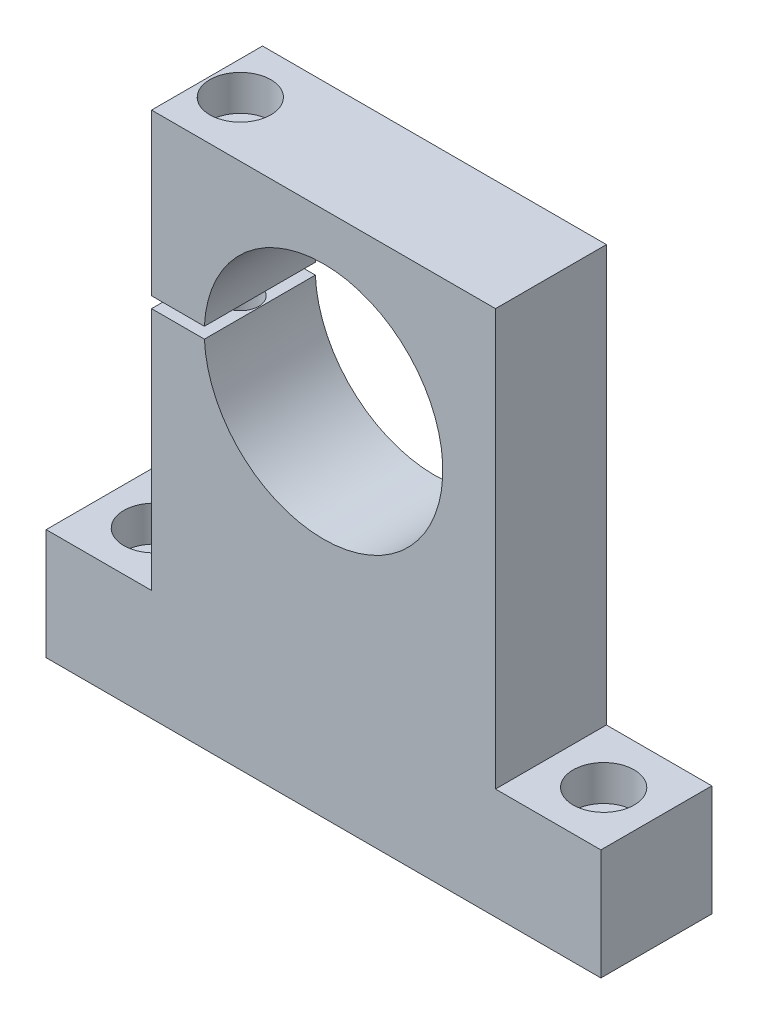
ISO-10303-21;
HEADER;
FILE_DESCRIPTION(('STEP AP214'),'2;1');
FILE_NAME('part.step','',(''),(''),'','','');
FILE_SCHEMA(('AUTOMOTIVE_DESIGN { 1 0 10303 214 1 1 1 1 }'));
ENDSEC;
DATA;
#1=APPLICATION_CONTEXT('core data for automotive mechanical design processes');
#2=APPLICATION_PROTOCOL_DEFINITION('international standard','automotive_design',2000,#1);
#3=PRODUCT_CONTEXT('',#1,'mechanical');
#4=PRODUCT('Part','Part','',(#3));
#5=PRODUCT_RELATED_PRODUCT_CATEGORY('part','',(#4));
#6=PRODUCT_DEFINITION_FORMATION('','',#4);
#7=PRODUCT_DEFINITION_CONTEXT('part definition',#1,'design');
#8=PRODUCT_DEFINITION('design','',#6,#7);
#9=PRODUCT_DEFINITION_SHAPE('','',#8);
#10=(LENGTH_UNIT() NAMED_UNIT(*) SI_UNIT(.MILLI.,.METRE.));
#11=(NAMED_UNIT(*) PLANE_ANGLE_UNIT() SI_UNIT($,.RADIAN.));
#12=(NAMED_UNIT(*) SI_UNIT($,.STERADIAN.) SOLID_ANGLE_UNIT());
#13=UNCERTAINTY_MEASURE_WITH_UNIT(LENGTH_MEASURE(1.E-05),#10,'distance_accuracy_value','');
#14=(GEOMETRIC_REPRESENTATION_CONTEXT(3) GLOBAL_UNCERTAINTY_ASSIGNED_CONTEXT((#13)) GLOBAL_UNIT_ASSIGNED_CONTEXT((#10,
#11,#12)) REPRESENTATION_CONTEXT('',''));
#15=CARTESIAN_POINT('',(0.,0.,0.));
#16=DIRECTION('',(0.,0.,1.));
#17=DIRECTION('',(1.,0.,0.));
#18=AXIS2_PLACEMENT_3D('',#15,#16,#17);
#19=CARTESIAN_POINT('',(19.,20.,20.));
#20=DIRECTION('',(1.,0.,0.));
#21=DIRECTION('',(0.,0.,-1.));
#22=AXIS2_PLACEMENT_3D('',#19,#20,#21);
#23=PLANE('',#22);
#24=DIRECTION('',(0.,-1.,0.));
#25=VECTOR('',#24,1.);
#26=CARTESIAN_POINT('',(19.,20.,0.));
#27=LINE('',#26,#25);
#28=CARTESIAN_POINT('',(19.,95.,0.));
#29=VERTEX_POINT('',#28);
#30=CARTESIAN_POINT('',(19.,66.,0.));
#31=VERTEX_POINT('',#30);
#32=EDGE_CURVE('E187',#29,#31,#27,.T.);
#33=ORIENTED_EDGE('',*,*,#32,.T.);
#34=DIRECTION('',(0.,0.,1.));
#35=VECTOR('',#34,1.);
#36=CARTESIAN_POINT('',(19.,66.,20.));
#37=LINE('',#36,#35);
#38=CARTESIAN_POINT('',(19.,66.,20.));
#39=VERTEX_POINT('',#38);
#40=EDGE_CURVE('E221',#31,#39,#37,.T.);
#41=ORIENTED_EDGE('',*,*,#40,.T.);
#42=DIRECTION('',(0.,-1.,0.));
#43=VECTOR('',#42,1.);
#44=CARTESIAN_POINT('',(19.,20.,20.));
#45=LINE('',#44,#43);
#46=CARTESIAN_POINT('',(19.,95.,20.));
#47=VERTEX_POINT('',#46);
#48=EDGE_CURVE('E169',#47,#39,#45,.T.);
#49=ORIENTED_EDGE('',*,*,#48,.F.);
#50=DIRECTION('',(0.,0.,-1.));
#51=VECTOR('',#50,1.);
#52=CARTESIAN_POINT('',(19.,95.,20.));
#53=LINE('',#52,#51);
#54=EDGE_CURVE('E196',#47,#29,#53,.T.);
#55=ORIENTED_EDGE('',*,*,#54,.T.);
#56=EDGE_LOOP('',(#33,#41,#49,#55));
#57=FACE_BOUND('',#56,.T.);
#58=ADVANCED_FACE('F35',(#57),#23,.F.);
#59=CARTESIAN_POINT('',(25.,95.,10.));
#60=DIRECTION('',(0.,1.,0.));
#61=DIRECTION('',(0.,0.,1.));
#62=AXIS2_PLACEMENT_3D('',#59,#60,#61);
#63=CYLINDRICAL_SURFACE('',#62,3.29999999999999);
#64=CARTESIAN_POINT('',(25.,66.,10.));
#65=DIRECTION('',(0.,1.,0.));
#66=DIRECTION('',(0.,0.,1.));
#67=AXIS2_PLACEMENT_3D('',#64,#65,#66);
#68=CIRCLE('',#67,3.29999999999999);
#69=CARTESIAN_POINT('',(25.,66.,13.3));
#70=VERTEX_POINT('',#69);
#71=EDGE_CURVE('E39',#70,#70,#68,.F.);
#72=ORIENTED_EDGE('',*,*,#71,.T.);
#73=EDGE_LOOP('',(#72));
#74=FACE_BOUND('',#73,.T.);
#75=CARTESIAN_POINT('',(25.,88.6,10.));
#76=DIRECTION('',(0.,1.,0.));
#77=DIRECTION('',(0.,0.,1.));
#78=AXIS2_PLACEMENT_3D('',#75,#76,#77);
#79=CIRCLE('',#78,3.30000000000001);
#80=CARTESIAN_POINT('',(25.,88.6,13.3));
#81=VERTEX_POINT('',#80);
#82=EDGE_CURVE('E230',#81,#81,#79,.T.);
#83=ORIENTED_EDGE('',*,*,#82,.T.);
#84=EDGE_LOOP('',(#83));
#85=FACE_BOUND('',#84,.T.);
#86=ADVANCED_FACE('F324',(#74,#85),#63,.F.);
#87=CARTESIAN_POINT('',(0.,0.,20.));
#88=DIRECTION('',(0.,0.,-1.));
#89=DIRECTION('',(-1.,0.,0.));
#90=AXIS2_PLACEMENT_3D('',#87,#88,#89);
#91=PLANE('',#90);
#92=ORIENTED_EDGE('',*,*,#48,.T.);
#93=DIRECTION('',(1.,0.,0.));
#94=VECTOR('',#93,1.);
#95=CARTESIAN_POINT('',(15.9047146945495,66.,20.));
#96=LINE('',#95,#94);
#97=CARTESIAN_POINT('',(28.5232684050855,66.,20.));
#98=VERTEX_POINT('',#97);
#99=EDGE_CURVE('E210',#39,#98,#96,.T.);
#100=ORIENTED_EDGE('',*,*,#99,.T.);
#101=CARTESIAN_POINT('',(50.,65.,20.));
#102=DIRECTION('',(0.,0.,1.));
#103=DIRECTION('',(1.,0.,0.));
#104=AXIS2_PLACEMENT_3D('',#101,#102,#103);
#105=CIRCLE('',#104,21.5);
#106=CARTESIAN_POINT('',(28.5232684050855,64.,20.));
#107=VERTEX_POINT('',#106);
#108=EDGE_CURVE('E145',#107,#98,#105,.T.);
#109=ORIENTED_EDGE('',*,*,#108,.F.);
#110=DIRECTION('',(-1.,0.,0.));
#111=VECTOR('',#110,1.);
#112=CARTESIAN_POINT('',(15.9047146945495,64.,20.));
#113=LINE('',#112,#111);
#114=CARTESIAN_POINT('',(19.,64.,20.));
#115=VERTEX_POINT('',#114);
#116=EDGE_CURVE('E60',#107,#115,#113,.T.);
#117=ORIENTED_EDGE('',*,*,#116,.T.);
#118=CARTESIAN_POINT('',(19.,20.,20.));
#119=VERTEX_POINT('',#118);
#120=EDGE_CURVE('E168',#115,#119,#45,.T.);
#121=ORIENTED_EDGE('',*,*,#120,.T.);
#122=DIRECTION('',(-1.,0.,0.));
#123=VECTOR('',#122,1.);
#124=CARTESIAN_POINT('',(0.,20.,20.));
#125=LINE('',#124,#123);
#126=CARTESIAN_POINT('',(0.,20.,20.));
#127=VERTEX_POINT('',#126);
#128=EDGE_CURVE('E172',#119,#127,#125,.T.);
#129=ORIENTED_EDGE('',*,*,#128,.T.);
#130=DIRECTION('',(0.,-1.,0.));
#131=VECTOR('',#130,1.);
#132=CARTESIAN_POINT('',(0.,0.,20.));
#133=LINE('',#132,#131);
#134=CARTESIAN_POINT('',(0.,0.,20.));
#135=VERTEX_POINT('',#134);
#136=EDGE_CURVE('E154',#127,#135,#133,.T.);
#137=ORIENTED_EDGE('',*,*,#136,.T.);
#138=DIRECTION('',(1.,0.,0.));
#139=VECTOR('',#138,1.);
#140=CARTESIAN_POINT('',(0.,0.,20.));
#141=LINE('',#140,#139);
#142=CARTESIAN_POINT('',(100.,0.,20.));
#143=VERTEX_POINT('',#142);
#144=EDGE_CURVE('E157',#135,#143,#141,.T.);
#145=ORIENTED_EDGE('',*,*,#144,.T.);
#146=DIRECTION('',(0.,1.,0.));
#147=VECTOR('',#146,1.);
#148=CARTESIAN_POINT('',(100.,0.,20.));
#149=LINE('',#148,#147);
#150=CARTESIAN_POINT('',(100.,20.,20.));
#151=VERTEX_POINT('',#150);
#152=EDGE_CURVE('E160',#143,#151,#149,.T.);
#153=ORIENTED_EDGE('',*,*,#152,.T.);
#154=DIRECTION('',(-1.,0.,0.));
#155=VECTOR('',#154,1.);
#156=CARTESIAN_POINT('',(100.,20.,20.));
#157=LINE('',#156,#155);
#158=CARTESIAN_POINT('',(81.,20.,20.));
#159=VERTEX_POINT('',#158);
#160=EDGE_CURVE('E162',#151,#159,#157,.T.);
#161=ORIENTED_EDGE('',*,*,#160,.T.);
#162=DIRECTION('',(0.,1.,0.));
#163=VECTOR('',#162,1.);
#164=CARTESIAN_POINT('',(81.,20.,20.));
#165=LINE('',#164,#163);
#166=CARTESIAN_POINT('',(81.,95.,20.));
#167=VERTEX_POINT('',#166);
#168=EDGE_CURVE('E164',#159,#167,#165,.T.);
#169=ORIENTED_EDGE('',*,*,#168,.T.);
#170=DIRECTION('',(-1.,0.,0.));
#171=VECTOR('',#170,1.);
#172=CARTESIAN_POINT('',(19.,95.,20.));
#173=LINE('',#172,#171);
#174=EDGE_CURVE('E166',#167,#47,#173,.T.);
#175=ORIENTED_EDGE('',*,*,#174,.T.);
#176=EDGE_LOOP('',(#92,#100,#109,#117,#121,#129,#137,#145,#153,#161,#169,#175));
#177=FACE_BOUND('',#176,.T.);
#178=ADVANCED_FACE('F295',(#177),#91,.F.);
#179=CARTESIAN_POINT('',(0.,0.,0.));
#180=DIRECTION('',(0.,0.,-1.));
#181=DIRECTION('',(-1.,0.,0.));
#182=AXIS2_PLACEMENT_3D('',#179,#180,#181);
#183=PLANE('',#182);
#184=DIRECTION('',(1.,0.,0.));
#185=VECTOR('',#184,1.);
#186=CARTESIAN_POINT('',(15.9047146945495,66.,0.));
#187=LINE('',#186,#185);
#188=CARTESIAN_POINT('',(28.5232684050855,66.,0.));
#189=VERTEX_POINT('',#188);
#190=EDGE_CURVE('E52',#31,#189,#187,.T.);
#191=ORIENTED_EDGE('',*,*,#190,.F.);
#192=ORIENTED_EDGE('',*,*,#32,.F.);
#193=DIRECTION('',(-1.,0.,0.));
#194=VECTOR('',#193,1.);
#195=CARTESIAN_POINT('',(19.,95.,0.));
#196=LINE('',#195,#194);
#197=CARTESIAN_POINT('',(81.,95.,0.));
#198=VERTEX_POINT('',#197);
#199=EDGE_CURVE('E185',#198,#29,#196,.T.);
#200=ORIENTED_EDGE('',*,*,#199,.F.);
#201=DIRECTION('',(0.,1.,0.));
#202=VECTOR('',#201,1.);
#203=CARTESIAN_POINT('',(81.,20.,0.));
#204=LINE('',#203,#202);
#205=CARTESIAN_POINT('',(81.,20.,0.));
#206=VERTEX_POINT('',#205);
#207=EDGE_CURVE('E183',#206,#198,#204,.T.);
#208=ORIENTED_EDGE('',*,*,#207,.F.);
#209=DIRECTION('',(-1.,0.,0.));
#210=VECTOR('',#209,1.);
#211=CARTESIAN_POINT('',(100.,20.,0.));
#212=LINE('',#211,#210);
#213=CARTESIAN_POINT('',(100.,20.,0.));
#214=VERTEX_POINT('',#213);
#215=EDGE_CURVE('E181',#214,#206,#212,.T.);
#216=ORIENTED_EDGE('',*,*,#215,.F.);
#217=DIRECTION('',(0.,1.,0.));
#218=VECTOR('',#217,1.);
#219=CARTESIAN_POINT('',(100.,0.,0.));
#220=LINE('',#219,#218);
#221=CARTESIAN_POINT('',(100.,0.,0.));
#222=VERTEX_POINT('',#221);
#223=EDGE_CURVE('E179',#222,#214,#220,.T.);
#224=ORIENTED_EDGE('',*,*,#223,.F.);
#225=DIRECTION('',(1.,0.,0.));
#226=VECTOR('',#225,1.);
#227=CARTESIAN_POINT('',(0.,0.,0.));
#228=LINE('',#227,#226);
#229=CARTESIAN_POINT('',(0.,0.,0.));
#230=VERTEX_POINT('',#229);
#231=EDGE_CURVE('E177',#230,#222,#228,.T.);
#232=ORIENTED_EDGE('',*,*,#231,.F.);
#233=DIRECTION('',(0.,-1.,0.));
#234=VECTOR('',#233,1.);
#235=CARTESIAN_POINT('',(0.,0.,0.));
#236=LINE('',#235,#234);
#237=CARTESIAN_POINT('',(0.,20.,0.));
#238=VERTEX_POINT('',#237);
#239=EDGE_CURVE('E148',#238,#230,#236,.T.);
#240=ORIENTED_EDGE('',*,*,#239,.F.);
#241=DIRECTION('',(-1.,0.,0.));
#242=VECTOR('',#241,1.);
#243=CARTESIAN_POINT('',(0.,20.,0.));
#244=LINE('',#243,#242);
#245=CARTESIAN_POINT('',(19.,20.,0.));
#246=VERTEX_POINT('',#245);
#247=EDGE_CURVE('E158',#246,#238,#244,.T.);
#248=ORIENTED_EDGE('',*,*,#247,.F.);
#249=CARTESIAN_POINT('',(19.,64.,0.));
#250=VERTEX_POINT('',#249);
#251=EDGE_CURVE('E141',#250,#246,#27,.T.);
#252=ORIENTED_EDGE('',*,*,#251,.F.);
#253=DIRECTION('',(-1.,0.,0.));
#254=VECTOR('',#253,1.);
#255=CARTESIAN_POINT('',(15.9047146945495,64.,0.));
#256=LINE('',#255,#254);
#257=CARTESIAN_POINT('',(28.5232684050855,64.,0.));
#258=VERTEX_POINT('',#257);
#259=EDGE_CURVE('E126',#258,#250,#256,.T.);
#260=ORIENTED_EDGE('',*,*,#259,.F.);
#261=CARTESIAN_POINT('',(50.,65.,0.));
#262=DIRECTION('',(0.,0.,1.));
#263=DIRECTION('',(1.,0.,0.));
#264=AXIS2_PLACEMENT_3D('',#261,#262,#263);
#265=CIRCLE('',#264,21.5);
#266=EDGE_CURVE('E139',#258,#189,#265,.T.);
#267=ORIENTED_EDGE('',*,*,#266,.T.);
#268=EDGE_LOOP('',(#191,#192,#200,#208,#216,#224,#232,#240,#248,#252,#260,#267));
#269=FACE_BOUND('',#268,.T.);
#270=ADVANCED_FACE('F138',(#269),#183,.T.);
#271=CARTESIAN_POINT('',(0.,0.,20.));
#272=DIRECTION('',(1.,0.,0.));
#273=DIRECTION('',(0.,0.,-1.));
#274=AXIS2_PLACEMENT_3D('',#271,#272,#273);
#275=PLANE('',#274);
#276=ORIENTED_EDGE('',*,*,#239,.T.);
#277=DIRECTION('',(0.,0.,-1.));
#278=VECTOR('',#277,1.);
#279=CARTESIAN_POINT('',(0.,0.,20.));
#280=LINE('',#279,#278);
#281=EDGE_CURVE('E11',#135,#230,#280,.T.);
#282=ORIENTED_EDGE('',*,*,#281,.F.);
#283=ORIENTED_EDGE('',*,*,#136,.F.);
#284=DIRECTION('',(0.,0.,-1.));
#285=VECTOR('',#284,1.);
#286=CARTESIAN_POINT('',(0.,20.,20.));
#287=LINE('',#286,#285);
#288=EDGE_CURVE('E174',#127,#238,#287,.T.);
#289=ORIENTED_EDGE('',*,*,#288,.T.);
#290=EDGE_LOOP('',(#276,#282,#283,#289));
#291=FACE_BOUND('',#290,.T.);
#292=ADVANCED_FACE('F37',(#291),#275,.F.);
#293=CARTESIAN_POINT('',(0.,0.,20.));
#294=DIRECTION('',(0.,1.,0.));
#295=DIRECTION('',(0.,0.,1.));
#296=AXIS2_PLACEMENT_3D('',#293,#294,#295);
#297=PLANE('',#296);
#298=CARTESIAN_POINT('',(25.,0.,10.));
#299=DIRECTION('',(0.,1.,0.));
#300=DIRECTION('',(0.,0.,1.));
#301=AXIS2_PLACEMENT_3D('',#298,#299,#300);
#302=CIRCLE('',#301,3.29999999999998);
#303=CARTESIAN_POINT('',(25.,0.,13.3));
#304=VERTEX_POINT('',#303);
#305=EDGE_CURVE('E233',#304,#304,#302,.T.);
#306=ORIENTED_EDGE('',*,*,#305,.T.);
#307=EDGE_LOOP('',(#306));
#308=FACE_BOUND('',#307,.T.);
#309=CARTESIAN_POINT('',(9.5,0.,10.));
#310=DIRECTION('',(0.,1.,0.));
#311=DIRECTION('',(0.,0.,1.));
#312=AXIS2_PLACEMENT_3D('',#309,#310,#311);
#313=CIRCLE('',#312,3.3);
#314=CARTESIAN_POINT('',(9.5,0.,13.3));
#315=VERTEX_POINT('',#314);
#316=EDGE_CURVE('E245',#315,#315,#313,.T.);
#317=ORIENTED_EDGE('',*,*,#316,.T.);
#318=EDGE_LOOP('',(#317));
#319=FACE_BOUND('',#318,.T.);
#320=CARTESIAN_POINT('',(90.5,0.,9.99999999999999));
#321=DIRECTION('',(0.,1.,0.));
#322=DIRECTION('',(0.,0.,1.));
#323=AXIS2_PLACEMENT_3D('',#320,#321,#322);
#324=CIRCLE('',#323,3.3);
#325=CARTESIAN_POINT('',(90.5,0.,13.3));
#326=VERTEX_POINT('',#325);
#327=EDGE_CURVE('E146',#326,#326,#324,.T.);
#328=ORIENTED_EDGE('',*,*,#327,.T.);
#329=EDGE_LOOP('',(#328));
#330=FACE_BOUND('',#329,.T.);
#331=ORIENTED_EDGE('',*,*,#231,.T.);
#332=DIRECTION('',(0.,0.,-1.));
#333=VECTOR('',#332,1.);
#334=CARTESIAN_POINT('',(100.,0.,20.));
#335=LINE('',#334,#333);
#336=EDGE_CURVE('E44',#143,#222,#335,.T.);
#337=ORIENTED_EDGE('',*,*,#336,.F.);
#338=ORIENTED_EDGE('',*,*,#144,.F.);
#339=ORIENTED_EDGE('',*,*,#281,.T.);
#340=EDGE_LOOP('',(#331,#337,#338,#339));
#341=FACE_BOUND('',#340,.T.);
#342=ADVANCED_FACE('F302',(#308,#319,#330,#341),#297,.F.);
#343=CARTESIAN_POINT('',(100.,0.,20.));
#344=DIRECTION('',(-1.,0.,0.));
#345=DIRECTION('',(0.,0.,1.));
#346=AXIS2_PLACEMENT_3D('',#343,#344,#345);
#347=PLANE('',#346);
#348=ORIENTED_EDGE('',*,*,#223,.T.);
#349=DIRECTION('',(0.,0.,-1.));
#350=VECTOR('',#349,1.);
#351=CARTESIAN_POINT('',(100.,20.,20.));
#352=LINE('',#351,#350);
#353=EDGE_CURVE('E205',#151,#214,#352,.T.);
#354=ORIENTED_EDGE('',*,*,#353,.F.);
#355=ORIENTED_EDGE('',*,*,#152,.F.);
#356=ORIENTED_EDGE('',*,*,#336,.T.);
#357=EDGE_LOOP('',(#348,#354,#355,#356));
#358=FACE_BOUND('',#357,.T.);
#359=ADVANCED_FACE('F276',(#358),#347,.F.);
#360=CARTESIAN_POINT('',(100.,20.,20.));
#361=DIRECTION('',(0.,-1.,0.));
#362=DIRECTION('',(0.,0.,-1.));
#363=AXIS2_PLACEMENT_3D('',#360,#361,#362);
#364=PLANE('',#363);
#365=CARTESIAN_POINT('',(90.5,20.,9.99999999999999));
#366=DIRECTION('',(0.,1.,0.));
#367=DIRECTION('',(0.,0.,1.));
#368=AXIS2_PLACEMENT_3D('',#365,#366,#367);
#369=CIRCLE('',#368,5.49999999999999);
#370=CARTESIAN_POINT('',(90.5,20.,15.5));
#371=VERTEX_POINT('',#370);
#372=EDGE_CURVE('E248',#371,#371,#369,.T.);
#373=ORIENTED_EDGE('',*,*,#372,.F.);
#374=EDGE_LOOP('',(#373));
#375=FACE_BOUND('',#374,.T.);
#376=ORIENTED_EDGE('',*,*,#215,.T.);
#377=DIRECTION('',(0.,0.,-1.));
#378=VECTOR('',#377,1.);
#379=CARTESIAN_POINT('',(81.,20.,20.));
#380=LINE('',#379,#378);
#381=EDGE_CURVE('E202',#159,#206,#380,.T.);
#382=ORIENTED_EDGE('',*,*,#381,.F.);
#383=ORIENTED_EDGE('',*,*,#160,.F.);
#384=ORIENTED_EDGE('',*,*,#353,.T.);
#385=EDGE_LOOP('',(#376,#382,#383,#384));
#386=FACE_BOUND('',#385,.T.);
#387=ADVANCED_FACE('F272',(#375,#386),#364,.F.);
#388=CARTESIAN_POINT('',(81.,20.,20.));
#389=DIRECTION('',(-1.,0.,0.));
#390=DIRECTION('',(0.,0.,1.));
#391=AXIS2_PLACEMENT_3D('',#388,#389,#390);
#392=PLANE('',#391);
#393=ORIENTED_EDGE('',*,*,#207,.T.);
#394=DIRECTION('',(0.,0.,-1.));
#395=VECTOR('',#394,1.);
#396=CARTESIAN_POINT('',(81.,95.,20.));
#397=LINE('',#396,#395);
#398=EDGE_CURVE('E199',#167,#198,#397,.T.);
#399=ORIENTED_EDGE('',*,*,#398,.F.);
#400=ORIENTED_EDGE('',*,*,#168,.F.);
#401=ORIENTED_EDGE('',*,*,#381,.T.);
#402=EDGE_LOOP('',(#393,#399,#400,#401));
#403=FACE_BOUND('',#402,.T.);
#404=ADVANCED_FACE('F275',(#403),#392,.F.);
#405=CARTESIAN_POINT('',(19.,95.,20.));
#406=DIRECTION('',(0.,-1.,0.));
#407=DIRECTION('',(0.,0.,-1.));
#408=AXIS2_PLACEMENT_3D('',#405,#406,#407);
#409=PLANE('',#408);
#410=CARTESIAN_POINT('',(25.,95.,10.));
#411=DIRECTION('',(0.,1.,0.));
#412=DIRECTION('',(0.,0.,1.));
#413=AXIS2_PLACEMENT_3D('',#410,#411,#412);
#414=CIRCLE('',#413,5.5);
#415=CARTESIAN_POINT('',(25.,95.,15.5));
#416=VERTEX_POINT('',#415);
#417=EDGE_CURVE('E224',#416,#416,#414,.T.);
#418=ORIENTED_EDGE('',*,*,#417,.F.);
#419=EDGE_LOOP('',(#418));
#420=FACE_BOUND('',#419,.T.);
#421=ORIENTED_EDGE('',*,*,#199,.T.);
#422=ORIENTED_EDGE('',*,*,#54,.F.);
#423=ORIENTED_EDGE('',*,*,#174,.F.);
#424=ORIENTED_EDGE('',*,*,#398,.T.);
#425=EDGE_LOOP('',(#421,#422,#423,#424));
#426=FACE_BOUND('',#425,.T.);
#427=ADVANCED_FACE('F291',(#420,#426),#409,.F.);
#428=ORIENTED_EDGE('',*,*,#120,.F.);
#429=DIRECTION('',(0.,0.,-1.));
#430=VECTOR('',#429,1.);
#431=CARTESIAN_POINT('',(19.,64.,20.));
#432=LINE('',#431,#430);
#433=EDGE_CURVE('E132',#115,#250,#432,.T.);
#434=ORIENTED_EDGE('',*,*,#433,.T.);
#435=ORIENTED_EDGE('',*,*,#251,.T.);
#436=DIRECTION('',(0.,0.,-1.));
#437=VECTOR('',#436,1.);
#438=CARTESIAN_POINT('',(19.,20.,20.));
#439=LINE('',#438,#437);
#440=EDGE_CURVE('E193',#119,#246,#439,.T.);
#441=ORIENTED_EDGE('',*,*,#440,.F.);
#442=EDGE_LOOP('',(#428,#434,#435,#441));
#443=FACE_BOUND('',#442,.T.);
#444=ADVANCED_FACE('F312',(#443),#23,.F.);
#445=CARTESIAN_POINT('',(0.,20.,20.));
#446=DIRECTION('',(0.,-1.,0.));
#447=DIRECTION('',(0.,0.,-1.));
#448=AXIS2_PLACEMENT_3D('',#445,#446,#447);
#449=PLANE('',#448);
#450=CARTESIAN_POINT('',(9.5,20.,10.));
#451=DIRECTION('',(0.,1.,0.));
#452=DIRECTION('',(0.,0.,1.));
#453=AXIS2_PLACEMENT_3D('',#450,#451,#452);
#454=CIRCLE('',#453,5.49999999999999);
#455=CARTESIAN_POINT('',(9.5,20.,15.5));
#456=VERTEX_POINT('',#455);
#457=EDGE_CURVE('E236',#456,#456,#454,.T.);
#458=ORIENTED_EDGE('',*,*,#457,.F.);
#459=EDGE_LOOP('',(#458));
#460=FACE_BOUND('',#459,.T.);
#461=ORIENTED_EDGE('',*,*,#247,.T.);
#462=ORIENTED_EDGE('',*,*,#288,.F.);
#463=ORIENTED_EDGE('',*,*,#128,.F.);
#464=ORIENTED_EDGE('',*,*,#440,.T.);
#465=EDGE_LOOP('',(#461,#462,#463,#464));
#466=FACE_BOUND('',#465,.T.);
#467=ADVANCED_FACE('F308',(#460,#466),#449,.F.);
#468=CARTESIAN_POINT('',(50.,65.,20.));
#469=DIRECTION('',(0.,0.,-1.));
#470=DIRECTION('',(-1.,0.,0.));
#471=AXIS2_PLACEMENT_3D('',#468,#469,#470);
#472=CYLINDRICAL_SURFACE('',#471,21.5);
#473=DIRECTION('',(0.,0.,-1.));
#474=VECTOR('',#473,1.);
#475=CARTESIAN_POINT('',(28.5232684050855,66.,20.));
#476=LINE('',#475,#474);
#477=EDGE_CURVE('E144',#189,#98,#476,.F.);
#478=ORIENTED_EDGE('',*,*,#477,.F.);
#479=ORIENTED_EDGE('',*,*,#266,.F.);
#480=DIRECTION('',(0.,0.,-1.));
#481=VECTOR('',#480,1.);
#482=CARTESIAN_POINT('',(28.5232684050855,64.,20.));
#483=LINE('',#482,#481);
#484=EDGE_CURVE('E123',#107,#258,#483,.T.);
#485=ORIENTED_EDGE('',*,*,#484,.F.);
#486=ORIENTED_EDGE('',*,*,#108,.T.);
#487=EDGE_LOOP('',(#478,#479,#485,#486));
#488=FACE_BOUND('',#487,.T.);
#489=ADVANCED_FACE('F143',(#488),#472,.F.);
#490=CARTESIAN_POINT('',(90.5,20.,9.99999999999999));
#491=DIRECTION('',(0.,1.,0.));
#492=DIRECTION('',(0.,0.,1.));
#493=AXIS2_PLACEMENT_3D('',#490,#491,#492);
#494=CYLINDRICAL_SURFACE('',#493,3.3);
#495=ORIENTED_EDGE('',*,*,#327,.F.);
#496=EDGE_LOOP('',(#495));
#497=FACE_BOUND('',#496,.T.);
#498=CARTESIAN_POINT('',(90.5,13.6,9.99999999999999));
#499=DIRECTION('',(0.,1.,0.));
#500=DIRECTION('',(0.,0.,1.));
#501=AXIS2_PLACEMENT_3D('',#498,#499,#500);
#502=CIRCLE('',#501,3.3);
#503=CARTESIAN_POINT('',(90.5,13.6,13.3));
#504=VERTEX_POINT('',#503);
#505=EDGE_CURVE('E151',#504,#504,#502,.T.);
#506=ORIENTED_EDGE('',*,*,#505,.T.);
#507=EDGE_LOOP('',(#506));
#508=FACE_BOUND('',#507,.T.);
#509=ADVANCED_FACE('F257',(#497,#508),#494,.F.);
#510=CARTESIAN_POINT('',(93.8,13.6,9.99999999999999));
#511=DIRECTION('',(0.,-1.,0.));
#512=DIRECTION('',(0.,0.,-1.));
#513=AXIS2_PLACEMENT_3D('',#510,#511,#512);
#514=PLANE('',#513);
#515=ORIENTED_EDGE('',*,*,#505,.F.);
#516=EDGE_LOOP('',(#515));
#517=FACE_BOUND('',#516,.T.);
#518=CARTESIAN_POINT('',(90.5,13.6,9.99999999999999));
#519=DIRECTION('',(0.,1.,0.));
#520=DIRECTION('',(0.,0.,1.));
#521=AXIS2_PLACEMENT_3D('',#518,#519,#520);
#522=CIRCLE('',#521,5.49999999999999);
#523=CARTESIAN_POINT('',(90.5,13.6,15.5));
#524=VERTEX_POINT('',#523);
#525=EDGE_CURVE('E251',#524,#524,#522,.T.);
#526=ORIENTED_EDGE('',*,*,#525,.T.);
#527=EDGE_LOOP('',(#526));
#528=FACE_BOUND('',#527,.T.);
#529=ADVANCED_FACE('F259',(#517,#528),#514,.F.);
#530=CARTESIAN_POINT('',(90.5,20.,9.99999999999999));
#531=DIRECTION('',(0.,1.,0.));
#532=DIRECTION('',(0.,0.,1.));
#533=AXIS2_PLACEMENT_3D('',#530,#531,#532);
#534=CYLINDRICAL_SURFACE('',#533,5.49999999999999);
#535=ORIENTED_EDGE('',*,*,#525,.F.);
#536=EDGE_LOOP('',(#535));
#537=FACE_BOUND('',#536,.T.);
#538=ORIENTED_EDGE('',*,*,#372,.T.);
#539=EDGE_LOOP('',(#538));
#540=FACE_BOUND('',#539,.T.);
#541=ADVANCED_FACE('F262',(#537,#540),#534,.F.);
#542=CARTESIAN_POINT('',(9.5,20.,10.));
#543=DIRECTION('',(0.,1.,0.));
#544=DIRECTION('',(0.,0.,1.));
#545=AXIS2_PLACEMENT_3D('',#542,#543,#544);
#546=CYLINDRICAL_SURFACE('',#545,3.3);
#547=ORIENTED_EDGE('',*,*,#316,.F.);
#548=EDGE_LOOP('',(#547));
#549=FACE_BOUND('',#548,.T.);
#550=CARTESIAN_POINT('',(9.5,13.6,10.));
#551=DIRECTION('',(0.,1.,0.));
#552=DIRECTION('',(0.,0.,1.));
#553=AXIS2_PLACEMENT_3D('',#550,#551,#552);
#554=CIRCLE('',#553,3.3);
#555=CARTESIAN_POINT('',(9.5,13.6,13.3));
#556=VERTEX_POINT('',#555);
#557=EDGE_CURVE('E242',#556,#556,#554,.T.);
#558=ORIENTED_EDGE('',*,*,#557,.T.);
#559=EDGE_LOOP('',(#558));
#560=FACE_BOUND('',#559,.T.);
#561=ADVANCED_FACE('F268',(#549,#560),#546,.F.);
#562=CARTESIAN_POINT('',(12.8,13.6,10.));
#563=DIRECTION('',(0.,-1.,0.));
#564=DIRECTION('',(0.,0.,-1.));
#565=AXIS2_PLACEMENT_3D('',#562,#563,#564);
#566=PLANE('',#565);
#567=ORIENTED_EDGE('',*,*,#557,.F.);
#568=EDGE_LOOP('',(#567));
#569=FACE_BOUND('',#568,.T.);
#570=CARTESIAN_POINT('',(9.5,13.6,10.));
#571=DIRECTION('',(0.,1.,0.));
#572=DIRECTION('',(0.,0.,1.));
#573=AXIS2_PLACEMENT_3D('',#570,#571,#572);
#574=CIRCLE('',#573,5.5);
#575=CARTESIAN_POINT('',(9.5,13.6,15.5));
#576=VERTEX_POINT('',#575);
#577=EDGE_CURVE('E239',#576,#576,#574,.T.);
#578=ORIENTED_EDGE('',*,*,#577,.T.);
#579=EDGE_LOOP('',(#578));
#580=FACE_BOUND('',#579,.T.);
#581=ADVANCED_FACE('F348',(#569,#580),#566,.F.);
#582=CARTESIAN_POINT('',(9.5,20.,10.));
#583=DIRECTION('',(0.,1.,0.));
#584=DIRECTION('',(0.,0.,1.));
#585=AXIS2_PLACEMENT_3D('',#582,#583,#584);
#586=CYLINDRICAL_SURFACE('',#585,5.5);
#587=ORIENTED_EDGE('',*,*,#577,.F.);
#588=EDGE_LOOP('',(#587));
#589=FACE_BOUND('',#588,.T.);
#590=ORIENTED_EDGE('',*,*,#457,.T.);
#591=EDGE_LOOP('',(#590));
#592=FACE_BOUND('',#591,.T.);
#593=ADVANCED_FACE('F341',(#589,#592),#586,.F.);
#594=CARTESIAN_POINT('',(25.,64.,10.));
#595=DIRECTION('',(0.,-1.,0.));
#596=DIRECTION('',(0.,0.,-1.));
#597=AXIS2_PLACEMENT_3D('',#594,#595,#596);
#598=CIRCLE('',#597,3.29999999999999);
#599=CARTESIAN_POINT('',(25.,64.,6.70000000000001));
#600=VERTEX_POINT('',#599);
#601=EDGE_CURVE('E133',#600,#600,#598,.F.);
#602=ORIENTED_EDGE('',*,*,#601,.T.);
#603=EDGE_LOOP('',(#602));
#604=FACE_BOUND('',#603,.T.);
#605=ORIENTED_EDGE('',*,*,#305,.F.);
#606=EDGE_LOOP('',(#605));
#607=FACE_BOUND('',#606,.T.);
#608=ADVANCED_FACE('F330',(#604,#607),#63,.F.);
#609=CARTESIAN_POINT('',(28.3,88.6,10.));
#610=DIRECTION('',(0.,-1.,0.));
#611=DIRECTION('',(0.,0.,-1.));
#612=AXIS2_PLACEMENT_3D('',#609,#610,#611);
#613=PLANE('',#612);
#614=ORIENTED_EDGE('',*,*,#82,.F.);
#615=EDGE_LOOP('',(#614));
#616=FACE_BOUND('',#615,.T.);
#617=CARTESIAN_POINT('',(25.,88.6,10.));
#618=DIRECTION('',(0.,1.,0.));
#619=DIRECTION('',(0.,0.,1.));
#620=AXIS2_PLACEMENT_3D('',#617,#618,#619);
#621=CIRCLE('',#620,5.5);
#622=CARTESIAN_POINT('',(25.,88.6,15.5));
#623=VERTEX_POINT('',#622);
#624=EDGE_CURVE('E227',#623,#623,#621,.T.);
#625=ORIENTED_EDGE('',*,*,#624,.T.);
#626=EDGE_LOOP('',(#625));
#627=FACE_BOUND('',#626,.T.);
#628=ADVANCED_FACE('F340',(#616,#627),#613,.F.);
#629=CARTESIAN_POINT('',(25.,95.,10.));
#630=DIRECTION('',(0.,1.,0.));
#631=DIRECTION('',(0.,0.,1.));
#632=AXIS2_PLACEMENT_3D('',#629,#630,#631);
#633=CYLINDRICAL_SURFACE('',#632,5.5);
#634=ORIENTED_EDGE('',*,*,#624,.F.);
#635=EDGE_LOOP('',(#634));
#636=FACE_BOUND('',#635,.T.);
#637=ORIENTED_EDGE('',*,*,#417,.T.);
#638=EDGE_LOOP('',(#637));
#639=FACE_BOUND('',#638,.T.);
#640=ADVANCED_FACE('F346',(#636,#639),#633,.F.);
#641=CARTESIAN_POINT('',(15.9047146945495,64.,20.));
#642=DIRECTION('',(0.,-1.,0.));
#643=DIRECTION('',(0.,0.,-1.));
#644=AXIS2_PLACEMENT_3D('',#641,#642,#643);
#645=PLANE('',#644);
#646=ORIENTED_EDGE('',*,*,#601,.F.);
#647=EDGE_LOOP('',(#646));
#648=FACE_BOUND('',#647,.T.);
#649=ORIENTED_EDGE('',*,*,#116,.F.);
#650=ORIENTED_EDGE('',*,*,#484,.T.);
#651=ORIENTED_EDGE('',*,*,#259,.T.);
#652=ORIENTED_EDGE('',*,*,#433,.F.);
#653=EDGE_LOOP('',(#649,#650,#651,#652));
#654=FACE_BOUND('',#653,.T.);
#655=ADVANCED_FACE('F125',(#648,#654),#645,.F.);
#656=CARTESIAN_POINT('',(15.9047146945495,66.,20.));
#657=DIRECTION('',(0.,1.,0.));
#658=DIRECTION('',(0.,0.,1.));
#659=AXIS2_PLACEMENT_3D('',#656,#657,#658);
#660=PLANE('',#659);
#661=ORIENTED_EDGE('',*,*,#71,.F.);
#662=EDGE_LOOP('',(#661));
#663=FACE_BOUND('',#662,.T.);
#664=ORIENTED_EDGE('',*,*,#190,.T.);
#665=ORIENTED_EDGE('',*,*,#477,.T.);
#666=ORIENTED_EDGE('',*,*,#99,.F.);
#667=ORIENTED_EDGE('',*,*,#40,.F.);
#668=EDGE_LOOP('',(#664,#665,#666,#667));
#669=FACE_BOUND('',#668,.T.);
#670=ADVANCED_FACE('F457',(#663,#669),#660,.F.);
#671=CLOSED_SHELL('',(#58,#86,#178,#270,#292,#342,#359,#387,#404,#427,#444,#467,#489,#509,#529,
#541,#561,#581,#593,#608,#628,#640,#655,#670));
#672=MANIFOLD_SOLID_BREP('B2',#671);
#673=ADVANCED_BREP_SHAPE_REPRESENTATION('',(#18,#672),#14);
#674=SHAPE_DEFINITION_REPRESENTATION(#9,#673);
ENDSEC;
END-ISO-10303-21;
